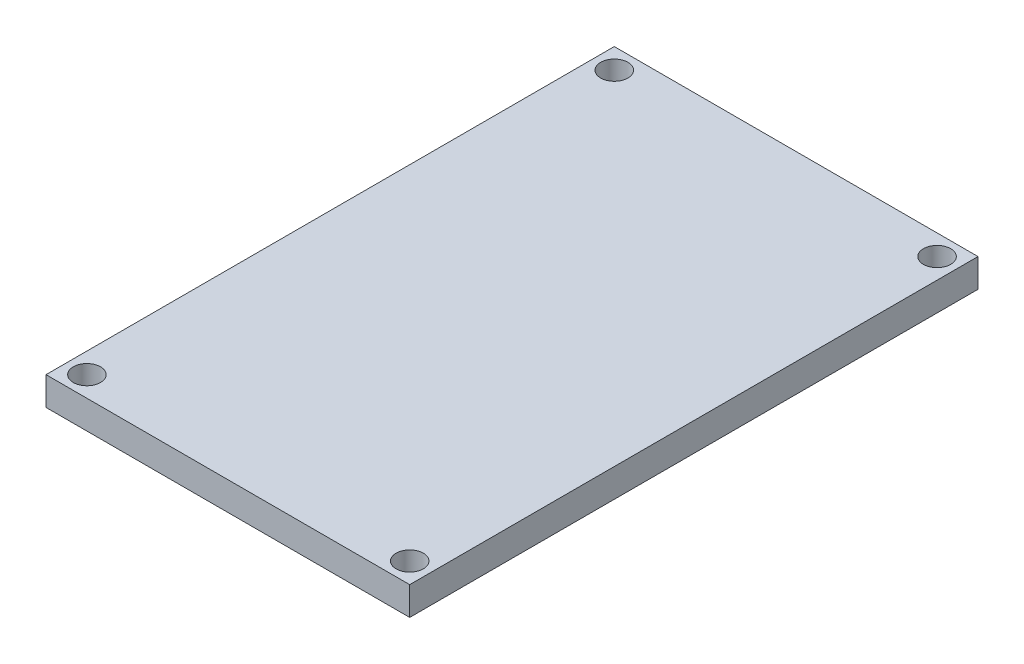
ISO-10303-21;
HEADER;
FILE_DESCRIPTION(('STEP AP214'),'2;1');
FILE_NAME('part.step','',(''),(''),'','','');
FILE_SCHEMA(('AUTOMOTIVE_DESIGN { 1 0 10303 214 1 1 1 1 }'));
ENDSEC;
DATA;
#1=APPLICATION_CONTEXT('core data for automotive mechanical design processes');
#2=APPLICATION_PROTOCOL_DEFINITION('international standard','automotive_design',2000,#1);
#3=PRODUCT_CONTEXT('',#1,'mechanical');
#4=PRODUCT('Part','Part','',(#3));
#5=PRODUCT_RELATED_PRODUCT_CATEGORY('part','',(#4));
#6=PRODUCT_DEFINITION_FORMATION('','',#4);
#7=PRODUCT_DEFINITION_CONTEXT('part definition',#1,'design');
#8=PRODUCT_DEFINITION('design','',#6,#7);
#9=PRODUCT_DEFINITION_SHAPE('','',#8);
#10=(LENGTH_UNIT() NAMED_UNIT(*) SI_UNIT(.MILLI.,.METRE.));
#11=(NAMED_UNIT(*) PLANE_ANGLE_UNIT() SI_UNIT($,.RADIAN.));
#12=(NAMED_UNIT(*) SI_UNIT($,.STERADIAN.) SOLID_ANGLE_UNIT());
#13=UNCERTAINTY_MEASURE_WITH_UNIT(LENGTH_MEASURE(1.E-05),#10,'distance_accuracy_value','');
#14=(GEOMETRIC_REPRESENTATION_CONTEXT(3) GLOBAL_UNCERTAINTY_ASSIGNED_CONTEXT((#13)) GLOBAL_UNIT_ASSIGNED_CONTEXT((#10,
#11,#12)) REPRESENTATION_CONTEXT('',''));
#15=CARTESIAN_POINT('',(0.,0.,0.));
#16=DIRECTION('',(0.,0.,1.));
#17=DIRECTION('',(1.,0.,0.));
#18=AXIS2_PLACEMENT_3D('',#15,#16,#17);
#19=CARTESIAN_POINT('',(0.,3.175,0.));
#20=DIRECTION('',(0.,0.,-1.));
#21=DIRECTION('',(-1.,0.,0.));
#22=AXIS2_PLACEMENT_3D('',#19,#20,#21);
#23=PLANE('',#22);
#24=DIRECTION('',(1.,0.,0.));
#25=VECTOR('',#24,1.);
#26=CARTESIAN_POINT('',(0.,0.,0.));
#27=LINE('',#26,#25);
#28=CARTESIAN_POINT('',(0.,0.,0.));
#29=VERTEX_POINT('',#28);
#30=CARTESIAN_POINT('',(40.64,0.,0.));
#31=VERTEX_POINT('',#30);
#32=EDGE_CURVE('E111',#29,#31,#27,.T.);
#33=ORIENTED_EDGE('',*,*,#32,.T.);
#34=DIRECTION('',(0.,-1.,0.));
#35=VECTOR('',#34,1.);
#36=CARTESIAN_POINT('',(40.64,3.175,0.));
#37=LINE('',#36,#35);
#38=CARTESIAN_POINT('',(40.64,3.175,0.));
#39=VERTEX_POINT('',#38);
#40=EDGE_CURVE('E11',#39,#31,#37,.T.);
#41=ORIENTED_EDGE('',*,*,#40,.F.);
#42=DIRECTION('',(1.,0.,0.));
#43=VECTOR('',#42,1.);
#44=CARTESIAN_POINT('',(0.,3.175,0.));
#45=LINE('',#44,#43);
#46=CARTESIAN_POINT('',(0.,3.175,0.));
#47=VERTEX_POINT('',#46);
#48=EDGE_CURVE('E85',#47,#39,#45,.T.);
#49=ORIENTED_EDGE('',*,*,#48,.F.);
#50=DIRECTION('',(0.,-1.,0.));
#51=VECTOR('',#50,1.);
#52=CARTESIAN_POINT('',(0.,3.175,0.));
#53=LINE('',#52,#51);
#54=EDGE_CURVE('E52',#47,#29,#53,.T.);
#55=ORIENTED_EDGE('',*,*,#54,.T.);
#56=EDGE_LOOP('',(#33,#41,#49,#55));
#57=FACE_BOUND('',#56,.T.);
#58=ADVANCED_FACE('F35',(#57),#23,.F.);
#59=CARTESIAN_POINT('',(40.64,3.175,0.));
#60=DIRECTION('',(-1.,0.,0.));
#61=DIRECTION('',(0.,0.,1.));
#62=AXIS2_PLACEMENT_3D('',#59,#60,#61);
#63=PLANE('',#62);
#64=DIRECTION('',(0.,0.,-1.));
#65=VECTOR('',#64,1.);
#66=CARTESIAN_POINT('',(40.64,0.,0.));
#67=LINE('',#66,#65);
#68=CARTESIAN_POINT('',(40.64,0.,-63.5));
#69=VERTEX_POINT('',#68);
#70=EDGE_CURVE('E90',#31,#69,#67,.T.);
#71=ORIENTED_EDGE('',*,*,#70,.T.);
#72=DIRECTION('',(0.,-1.,0.));
#73=VECTOR('',#72,1.);
#74=CARTESIAN_POINT('',(40.64,3.175,-63.5));
#75=LINE('',#74,#73);
#76=CARTESIAN_POINT('',(40.64,3.175,-63.5));
#77=VERTEX_POINT('',#76);
#78=EDGE_CURVE('E44',#77,#69,#75,.T.);
#79=ORIENTED_EDGE('',*,*,#78,.F.);
#80=DIRECTION('',(0.,0.,-1.));
#81=VECTOR('',#80,1.);
#82=CARTESIAN_POINT('',(40.64,3.175,0.));
#83=LINE('',#82,#81);
#84=EDGE_CURVE('E77',#39,#77,#83,.T.);
#85=ORIENTED_EDGE('',*,*,#84,.F.);
#86=ORIENTED_EDGE('',*,*,#40,.T.);
#87=EDGE_LOOP('',(#71,#79,#85,#86));
#88=FACE_BOUND('',#87,.T.);
#89=ADVANCED_FACE('F89',(#88),#63,.F.);
#90=CARTESIAN_POINT('',(0.,3.175,-63.5));
#91=DIRECTION('',(0.,0.,-1.));
#92=DIRECTION('',(-1.,0.,0.));
#93=AXIS2_PLACEMENT_3D('',#90,#91,#92);
#94=PLANE('',#93);
#95=DIRECTION('',(1.,0.,0.));
#96=VECTOR('',#95,1.);
#97=CARTESIAN_POINT('',(0.,0.,-63.5));
#98=LINE('',#97,#96);
#99=CARTESIAN_POINT('',(0.,0.,-63.5));
#100=VERTEX_POINT('',#99);
#101=EDGE_CURVE('E114',#100,#69,#98,.T.);
#102=ORIENTED_EDGE('',*,*,#101,.F.);
#103=DIRECTION('',(0.,-1.,0.));
#104=VECTOR('',#103,1.);
#105=CARTESIAN_POINT('',(0.,3.175,-63.5));
#106=LINE('',#105,#104);
#107=CARTESIAN_POINT('',(0.,3.175,-63.5));
#108=VERTEX_POINT('',#107);
#109=EDGE_CURVE('E66',#108,#100,#106,.T.);
#110=ORIENTED_EDGE('',*,*,#109,.F.);
#111=DIRECTION('',(1.,0.,0.));
#112=VECTOR('',#111,1.);
#113=CARTESIAN_POINT('',(0.,3.175,-63.5));
#114=LINE('',#113,#112);
#115=EDGE_CURVE('E84',#108,#77,#114,.T.);
#116=ORIENTED_EDGE('',*,*,#115,.T.);
#117=ORIENTED_EDGE('',*,*,#78,.T.);
#118=EDGE_LOOP('',(#102,#110,#116,#117));
#119=FACE_BOUND('',#118,.T.);
#120=ADVANCED_FACE('F93',(#119),#94,.T.);
#121=CARTESIAN_POINT('',(2.286,3.175,-61.214));
#122=DIRECTION('',(0.,-1.,0.));
#123=DIRECTION('',(0.,0.,-1.));
#124=AXIS2_PLACEMENT_3D('',#121,#122,#123);
#125=CYLINDRICAL_SURFACE('',#124,1.524);
#126=CARTESIAN_POINT('',(2.286,3.175,-61.214));
#127=DIRECTION('',(0.,1.,0.));
#128=DIRECTION('',(0.,0.,1.));
#129=AXIS2_PLACEMENT_3D('',#126,#127,#128);
#130=CIRCLE('',#129,1.524);
#131=CARTESIAN_POINT('',(2.286,3.175,-59.69));
#132=VERTEX_POINT('',#131);
#133=EDGE_CURVE('E133',#132,#132,#130,.T.);
#134=ORIENTED_EDGE('',*,*,#133,.T.);
#135=EDGE_LOOP('',(#134));
#136=FACE_BOUND('',#135,.T.);
#137=CARTESIAN_POINT('',(2.286,0.,-61.214));
#138=DIRECTION('',(0.,1.,0.));
#139=DIRECTION('',(0.,0.,1.));
#140=AXIS2_PLACEMENT_3D('',#137,#138,#139);
#141=CIRCLE('',#140,1.524);
#142=CARTESIAN_POINT('',(2.286,0.,-59.69));
#143=VERTEX_POINT('',#142);
#144=EDGE_CURVE('E108',#143,#143,#141,.T.);
#145=ORIENTED_EDGE('',*,*,#144,.F.);
#146=EDGE_LOOP('',(#145));
#147=FACE_BOUND('',#146,.T.);
#148=ADVANCED_FACE('F137',(#136,#147),#125,.F.);
#149=CARTESIAN_POINT('',(38.354,3.175,-61.214));
#150=DIRECTION('',(0.,-1.,0.));
#151=DIRECTION('',(0.,0.,-1.));
#152=AXIS2_PLACEMENT_3D('',#149,#150,#151);
#153=CYLINDRICAL_SURFACE('',#152,1.52400000000001);
#154=CARTESIAN_POINT('',(38.354,3.175,-61.214));
#155=DIRECTION('',(0.,1.,0.));
#156=DIRECTION('',(0.,0.,1.));
#157=AXIS2_PLACEMENT_3D('',#154,#155,#156);
#158=CIRCLE('',#157,1.52400000000001);
#159=CARTESIAN_POINT('',(38.354,3.175,-59.69));
#160=VERTEX_POINT('',#159);
#161=EDGE_CURVE('E128',#160,#160,#158,.T.);
#162=ORIENTED_EDGE('',*,*,#161,.T.);
#163=EDGE_LOOP('',(#162));
#164=FACE_BOUND('',#163,.T.);
#165=CARTESIAN_POINT('',(38.354,0.,-61.214));
#166=DIRECTION('',(0.,1.,0.));
#167=DIRECTION('',(0.,0.,1.));
#168=AXIS2_PLACEMENT_3D('',#165,#166,#167);
#169=CIRCLE('',#168,1.52400000000001);
#170=CARTESIAN_POINT('',(38.354,0.,-59.69));
#171=VERTEX_POINT('',#170);
#172=EDGE_CURVE('E105',#171,#171,#169,.T.);
#173=ORIENTED_EDGE('',*,*,#172,.F.);
#174=EDGE_LOOP('',(#173));
#175=FACE_BOUND('',#174,.T.);
#176=ADVANCED_FACE('F163',(#164,#175),#153,.F.);
#177=CARTESIAN_POINT('',(2.286,3.175,-2.286));
#178=DIRECTION('',(0.,-1.,0.));
#179=DIRECTION('',(0.,0.,-1.));
#180=AXIS2_PLACEMENT_3D('',#177,#178,#179);
#181=CYLINDRICAL_SURFACE('',#180,1.524);
#182=CARTESIAN_POINT('',(2.286,3.175,-2.286));
#183=DIRECTION('',(0.,1.,0.));
#184=DIRECTION('',(0.,0.,1.));
#185=AXIS2_PLACEMENT_3D('',#182,#183,#184);
#186=CIRCLE('',#185,1.524);
#187=CARTESIAN_POINT('',(2.286,3.175,-0.762000000000001));
#188=VERTEX_POINT('',#187);
#189=EDGE_CURVE('E123',#188,#188,#186,.T.);
#190=ORIENTED_EDGE('',*,*,#189,.T.);
#191=EDGE_LOOP('',(#190));
#192=FACE_BOUND('',#191,.T.);
#193=CARTESIAN_POINT('',(2.286,0.,-2.286));
#194=DIRECTION('',(0.,1.,0.));
#195=DIRECTION('',(0.,0.,1.));
#196=AXIS2_PLACEMENT_3D('',#193,#194,#195);
#197=CIRCLE('',#196,1.524);
#198=CARTESIAN_POINT('',(2.286,0.,-0.762000000000001));
#199=VERTEX_POINT('',#198);
#200=EDGE_CURVE('E102',#199,#199,#197,.T.);
#201=ORIENTED_EDGE('',*,*,#200,.F.);
#202=EDGE_LOOP('',(#201));
#203=FACE_BOUND('',#202,.T.);
#204=ADVANCED_FACE('F165',(#192,#203),#181,.F.);
#205=CARTESIAN_POINT('',(38.354,3.175,-2.286));
#206=DIRECTION('',(0.,-1.,0.));
#207=DIRECTION('',(0.,0.,-1.));
#208=AXIS2_PLACEMENT_3D('',#205,#206,#207);
#209=CYLINDRICAL_SURFACE('',#208,1.52400000000001);
#210=CARTESIAN_POINT('',(38.354,3.175,-2.286));
#211=DIRECTION('',(0.,1.,0.));
#212=DIRECTION('',(0.,0.,1.));
#213=AXIS2_PLACEMENT_3D('',#210,#211,#212);
#214=CIRCLE('',#213,1.52400000000001);
#215=CARTESIAN_POINT('',(38.354,3.175,-0.761999999999994));
#216=VERTEX_POINT('',#215);
#217=EDGE_CURVE('E119',#216,#216,#214,.T.);
#218=ORIENTED_EDGE('',*,*,#217,.T.);
#219=EDGE_LOOP('',(#218));
#220=FACE_BOUND('',#219,.T.);
#221=CARTESIAN_POINT('',(38.354,0.,-2.286));
#222=DIRECTION('',(0.,1.,0.));
#223=DIRECTION('',(0.,0.,1.));
#224=AXIS2_PLACEMENT_3D('',#221,#222,#223);
#225=CIRCLE('',#224,1.52400000000001);
#226=CARTESIAN_POINT('',(38.354,0.,-0.761999999999994));
#227=VERTEX_POINT('',#226);
#228=EDGE_CURVE('E99',#227,#227,#225,.T.);
#229=ORIENTED_EDGE('',*,*,#228,.F.);
#230=EDGE_LOOP('',(#229));
#231=FACE_BOUND('',#230,.T.);
#232=ADVANCED_FACE('F37',(#220,#231),#209,.F.);
#233=CARTESIAN_POINT('',(0.,3.175,0.));
#234=DIRECTION('',(-1.,0.,0.));
#235=DIRECTION('',(0.,0.,1.));
#236=AXIS2_PLACEMENT_3D('',#233,#234,#235);
#237=PLANE('',#236);
#238=DIRECTION('',(0.,0.,-1.));
#239=VECTOR('',#238,1.);
#240=CARTESIAN_POINT('',(0.,0.,0.));
#241=LINE('',#240,#239);
#242=EDGE_CURVE('E116',#29,#100,#241,.T.);
#243=ORIENTED_EDGE('',*,*,#242,.F.);
#244=ORIENTED_EDGE('',*,*,#54,.F.);
#245=DIRECTION('',(0.,0.,-1.));
#246=VECTOR('',#245,1.);
#247=CARTESIAN_POINT('',(0.,3.175,0.));
#248=LINE('',#247,#246);
#249=EDGE_CURVE('E94',#47,#108,#248,.T.);
#250=ORIENTED_EDGE('',*,*,#249,.T.);
#251=ORIENTED_EDGE('',*,*,#109,.T.);
#252=EDGE_LOOP('',(#243,#244,#250,#251));
#253=FACE_BOUND('',#252,.T.);
#254=ADVANCED_FACE('F142',(#253),#237,.T.);
#255=CARTESIAN_POINT('',(0.,3.175,0.));
#256=DIRECTION('',(0.,1.,0.));
#257=DIRECTION('',(0.,0.,1.));
#258=AXIS2_PLACEMENT_3D('',#255,#256,#257);
#259=PLANE('',#258);
#260=ORIENTED_EDGE('',*,*,#217,.F.);
#261=EDGE_LOOP('',(#260));
#262=FACE_BOUND('',#261,.T.);
#263=ORIENTED_EDGE('',*,*,#189,.F.);
#264=EDGE_LOOP('',(#263));
#265=FACE_BOUND('',#264,.T.);
#266=ORIENTED_EDGE('',*,*,#161,.F.);
#267=EDGE_LOOP('',(#266));
#268=FACE_BOUND('',#267,.T.);
#269=ORIENTED_EDGE('',*,*,#133,.F.);
#270=EDGE_LOOP('',(#269));
#271=FACE_BOUND('',#270,.T.);
#272=ORIENTED_EDGE('',*,*,#48,.T.);
#273=ORIENTED_EDGE('',*,*,#84,.T.);
#274=ORIENTED_EDGE('',*,*,#115,.F.);
#275=ORIENTED_EDGE('',*,*,#249,.F.);
#276=EDGE_LOOP('',(#272,#273,#274,#275));
#277=FACE_BOUND('',#276,.T.);
#278=ADVANCED_FACE('F81',(#262,#265,#268,#271,#277),#259,.T.);
#279=CARTESIAN_POINT('',(0.,0.,0.));
#280=DIRECTION('',(0.,1.,0.));
#281=DIRECTION('',(0.,0.,1.));
#282=AXIS2_PLACEMENT_3D('',#279,#280,#281);
#283=PLANE('',#282);
#284=ORIENTED_EDGE('',*,*,#228,.T.);
#285=EDGE_LOOP('',(#284));
#286=FACE_BOUND('',#285,.T.);
#287=ORIENTED_EDGE('',*,*,#200,.T.);
#288=EDGE_LOOP('',(#287));
#289=FACE_BOUND('',#288,.T.);
#290=ORIENTED_EDGE('',*,*,#172,.T.);
#291=EDGE_LOOP('',(#290));
#292=FACE_BOUND('',#291,.T.);
#293=ORIENTED_EDGE('',*,*,#144,.T.);
#294=EDGE_LOOP('',(#293));
#295=FACE_BOUND('',#294,.T.);
#296=ORIENTED_EDGE('',*,*,#32,.F.);
#297=ORIENTED_EDGE('',*,*,#242,.T.);
#298=ORIENTED_EDGE('',*,*,#101,.T.);
#299=ORIENTED_EDGE('',*,*,#70,.F.);
#300=EDGE_LOOP('',(#296,#297,#298,#299));
#301=FACE_BOUND('',#300,.T.);
#302=ADVANCED_FACE('F141',(#286,#289,#292,#295,#301),#283,.F.);
#303=CLOSED_SHELL('',(#58,#89,#120,#148,#176,#204,#232,#254,#278,#302));
#304=MANIFOLD_SOLID_BREP('B2',#303);
#305=ADVANCED_BREP_SHAPE_REPRESENTATION('',(#18,#304),#14);
#306=SHAPE_DEFINITION_REPRESENTATION(#9,#305);
ENDSEC;
END-ISO-10303-21;
